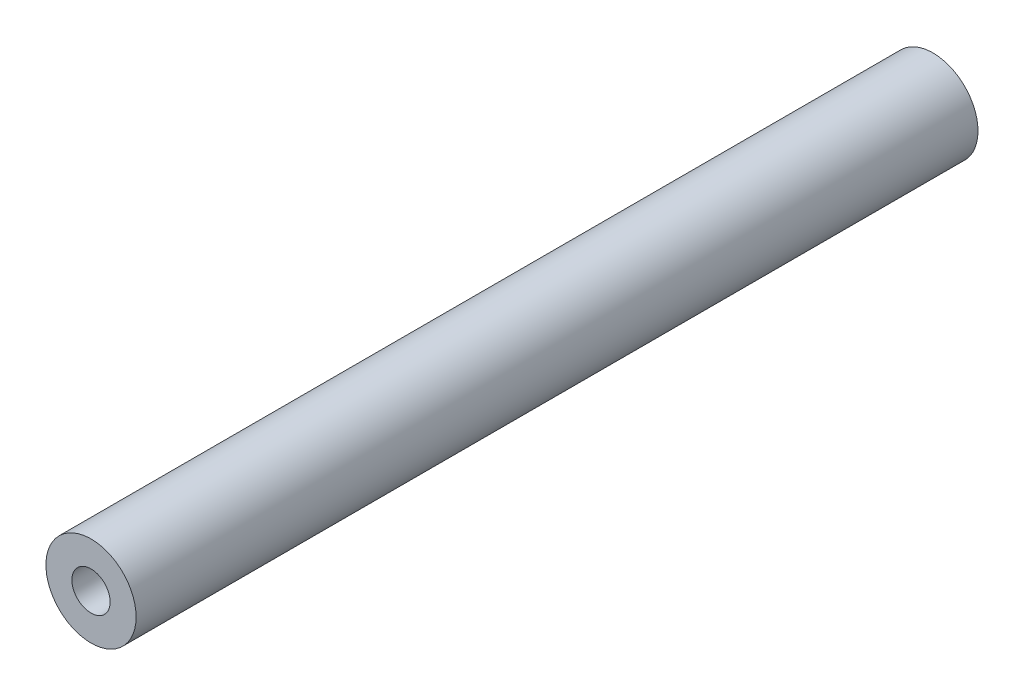
ISO-10303-21;
HEADER;
FILE_DESCRIPTION(('STEP AP214'),'2;1');
FILE_NAME('part.step','',(''),(''),'','','');
FILE_SCHEMA(('AUTOMOTIVE_DESIGN { 1 0 10303 214 1 1 1 1 }'));
ENDSEC;
DATA;
#1=APPLICATION_CONTEXT('core data for automotive mechanical design processes');
#2=APPLICATION_PROTOCOL_DEFINITION('international standard','automotive_design',2000,#1);
#3=PRODUCT_CONTEXT('',#1,'mechanical');
#4=PRODUCT('Part','Part','',(#3));
#5=PRODUCT_RELATED_PRODUCT_CATEGORY('part','',(#4));
#6=PRODUCT_DEFINITION_FORMATION('','',#4);
#7=PRODUCT_DEFINITION_CONTEXT('part definition',#1,'design');
#8=PRODUCT_DEFINITION('design','',#6,#7);
#9=PRODUCT_DEFINITION_SHAPE('','',#8);
#10=(LENGTH_UNIT() NAMED_UNIT(*) SI_UNIT(.MILLI.,.METRE.));
#11=(NAMED_UNIT(*) PLANE_ANGLE_UNIT() SI_UNIT($,.RADIAN.));
#12=(NAMED_UNIT(*) SI_UNIT($,.STERADIAN.) SOLID_ANGLE_UNIT());
#13=UNCERTAINTY_MEASURE_WITH_UNIT(LENGTH_MEASURE(1.E-05),#10,'distance_accuracy_value','');
#14=(GEOMETRIC_REPRESENTATION_CONTEXT(3) GLOBAL_UNCERTAINTY_ASSIGNED_CONTEXT((#13)) GLOBAL_UNIT_ASSIGNED_CONTEXT((#10,
#11,#12)) REPRESENTATION_CONTEXT('',''));
#15=CARTESIAN_POINT('',(0.,0.,0.));
#16=DIRECTION('',(0.,0.,1.));
#17=DIRECTION('',(1.,0.,0.));
#18=AXIS2_PLACEMENT_3D('',#15,#16,#17);
#19=CARTESIAN_POINT('',(0.,0.,44.45));
#20=DIRECTION('',(0.,0.,-1.));
#21=DIRECTION('',(-1.,0.,0.));
#22=AXIS2_PLACEMENT_3D('',#19,#20,#21);
#23=CYLINDRICAL_SURFACE('',#22,4.7625);
#24=CARTESIAN_POINT('',(0.,0.,44.45));
#25=DIRECTION('',(0.,0.,1.));
#26=DIRECTION('',(1.,0.,0.));
#27=AXIS2_PLACEMENT_3D('',#24,#25,#26);
#28=CIRCLE('',#27,4.7625);
#29=CARTESIAN_POINT('',(4.7625,0.,44.45));
#30=VERTEX_POINT('',#29);
#31=EDGE_CURVE('E11',#30,#30,#28,.T.);
#32=ORIENTED_EDGE('',*,*,#31,.F.);
#33=EDGE_LOOP('',(#32));
#34=FACE_BOUND('',#33,.T.);
#35=CARTESIAN_POINT('',(0.,0.,-44.45));
#36=DIRECTION('',(0.,0.,1.));
#37=DIRECTION('',(1.,0.,0.));
#38=AXIS2_PLACEMENT_3D('',#35,#36,#37);
#39=CIRCLE('',#38,4.7625);
#40=CARTESIAN_POINT('',(4.7625,0.,-44.45));
#41=VERTEX_POINT('',#40);
#42=EDGE_CURVE('E46',#41,#41,#39,.T.);
#43=ORIENTED_EDGE('',*,*,#42,.T.);
#44=EDGE_LOOP('',(#43));
#45=FACE_BOUND('',#44,.T.);
#46=ADVANCED_FACE('F43',(#34,#45),#23,.T.);
#47=CARTESIAN_POINT('',(0.,0.,44.45));
#48=DIRECTION('',(0.,0.,1.));
#49=DIRECTION('',(1.,0.,0.));
#50=AXIS2_PLACEMENT_3D('',#47,#48,#49);
#51=PLANE('',#50);
#52=CARTESIAN_POINT('',(0.,0.,44.45));
#53=DIRECTION('',(0.,0.,1.));
#54=DIRECTION('',(1.,0.,0.));
#55=AXIS2_PLACEMENT_3D('',#52,#53,#54);
#56=CIRCLE('',#55,2.01929999999999);
#57=CARTESIAN_POINT('',(2.01929999999999,0.,44.45));
#58=VERTEX_POINT('',#57);
#59=EDGE_CURVE('E67',#58,#58,#56,.T.);
#60=ORIENTED_EDGE('',*,*,#59,.F.);
#61=EDGE_LOOP('',(#60));
#62=FACE_BOUND('',#61,.T.);
#63=ORIENTED_EDGE('',*,*,#31,.T.);
#64=EDGE_LOOP('',(#63));
#65=FACE_BOUND('',#64,.T.);
#66=ADVANCED_FACE('F85',(#62,#65),#51,.T.);
#67=CARTESIAN_POINT('',(0.,0.,-44.45));
#68=DIRECTION('',(0.,0.,1.));
#69=DIRECTION('',(1.,0.,0.));
#70=AXIS2_PLACEMENT_3D('',#67,#68,#69);
#71=PLANE('',#70);
#72=CARTESIAN_POINT('',(0.,0.,-44.45));
#73=DIRECTION('',(0.,0.,-1.));
#74=DIRECTION('',(-1.,0.,0.));
#75=AXIS2_PLACEMENT_3D('',#72,#73,#74);
#76=CIRCLE('',#75,2.01929999999999);
#77=CARTESIAN_POINT('',(-2.01929999999999,0.,-44.45));
#78=VERTEX_POINT('',#77);
#79=EDGE_CURVE('E66',#78,#78,#76,.T.);
#80=ORIENTED_EDGE('',*,*,#79,.F.);
#81=EDGE_LOOP('',(#80));
#82=FACE_BOUND('',#81,.T.);
#83=ORIENTED_EDGE('',*,*,#42,.F.);
#84=EDGE_LOOP('',(#83));
#85=FACE_BOUND('',#84,.T.);
#86=ADVANCED_FACE('F82',(#82,#85),#71,.F.);
#87=CARTESIAN_POINT('',(0.,0.,-32.512));
#88=DIRECTION('',(0.,0.,-1.));
#89=DIRECTION('',(-1.,0.,0.));
#90=AXIS2_PLACEMENT_3D('',#87,#88,#89);
#91=CONICAL_SURFACE('',#90,2.01929999999999,1.02974425867665);
#92=CARTESIAN_POINT('',(0.,0.,-31.2986821519976));
#93=VERTEX_POINT('',#92);
#94=VERTEX_LOOP('',#93);
#95=FACE_BOUND('',#94,.T.);
#96=CARTESIAN_POINT('',(0.,0.,-32.512));
#97=DIRECTION('',(0.,0.,-1.));
#98=DIRECTION('',(-1.,0.,0.));
#99=AXIS2_PLACEMENT_3D('',#96,#97,#98);
#100=CIRCLE('',#99,2.01929999999999);
#101=CARTESIAN_POINT('',(-2.01929999999999,0.,-32.512));
#102=VERTEX_POINT('',#101);
#103=EDGE_CURVE('E70',#102,#102,#100,.T.);
#104=ORIENTED_EDGE('',*,*,#103,.T.);
#105=EDGE_LOOP('',(#104));
#106=FACE_BOUND('',#105,.T.);
#107=ADVANCED_FACE('F84',(#95,#106),#91,.F.);
#108=CARTESIAN_POINT('',(0.,0.,-44.45));
#109=DIRECTION('',(0.,0.,-1.));
#110=DIRECTION('',(-1.,0.,0.));
#111=AXIS2_PLACEMENT_3D('',#108,#109,#110);
#112=CYLINDRICAL_SURFACE('',#111,2.01929999999999);
#113=ORIENTED_EDGE('',*,*,#103,.F.);
#114=EDGE_LOOP('',(#113));
#115=FACE_BOUND('',#114,.T.);
#116=ORIENTED_EDGE('',*,*,#79,.T.);
#117=EDGE_LOOP('',(#116));
#118=FACE_BOUND('',#117,.T.);
#119=ADVANCED_FACE('F60',(#115,#118),#112,.F.);
#120=CARTESIAN_POINT('',(0.,0.,32.512));
#121=DIRECTION('',(0.,0.,1.));
#122=DIRECTION('',(1.,0.,0.));
#123=AXIS2_PLACEMENT_3D('',#120,#121,#122);
#124=CONICAL_SURFACE('',#123,2.01929999999999,1.02974425867665);
#125=CARTESIAN_POINT('',(0.,0.,31.2986821519976));
#126=VERTEX_POINT('',#125);
#127=VERTEX_LOOP('',#126);
#128=FACE_BOUND('',#127,.T.);
#129=CARTESIAN_POINT('',(0.,0.,32.512));
#130=DIRECTION('',(0.,0.,1.));
#131=DIRECTION('',(1.,0.,0.));
#132=AXIS2_PLACEMENT_3D('',#129,#130,#131);
#133=CIRCLE('',#132,2.01929999999999);
#134=CARTESIAN_POINT('',(2.01929999999999,0.,32.512));
#135=VERTEX_POINT('',#134);
#136=EDGE_CURVE('E64',#135,#135,#133,.T.);
#137=ORIENTED_EDGE('',*,*,#136,.T.);
#138=EDGE_LOOP('',(#137));
#139=FACE_BOUND('',#138,.T.);
#140=ADVANCED_FACE('F56',(#128,#139),#124,.F.);
#141=CARTESIAN_POINT('',(0.,0.,44.45));
#142=DIRECTION('',(0.,0.,1.));
#143=DIRECTION('',(1.,0.,0.));
#144=AXIS2_PLACEMENT_3D('',#141,#142,#143);
#145=CYLINDRICAL_SURFACE('',#144,2.01929999999999);
#146=ORIENTED_EDGE('',*,*,#136,.F.);
#147=EDGE_LOOP('',(#146));
#148=FACE_BOUND('',#147,.T.);
#149=ORIENTED_EDGE('',*,*,#59,.T.);
#150=EDGE_LOOP('',(#149));
#151=FACE_BOUND('',#150,.T.);
#152=ADVANCED_FACE('F59',(#148,#151),#145,.F.);
#153=CLOSED_SHELL('',(#46,#66,#86,#107,#119,#140,#152));
#154=MANIFOLD_SOLID_BREP('B2',#153);
#155=ADVANCED_BREP_SHAPE_REPRESENTATION('',(#18,#154),#14);
#156=SHAPE_DEFINITION_REPRESENTATION(#9,#155);
ENDSEC;
END-ISO-10303-21;
